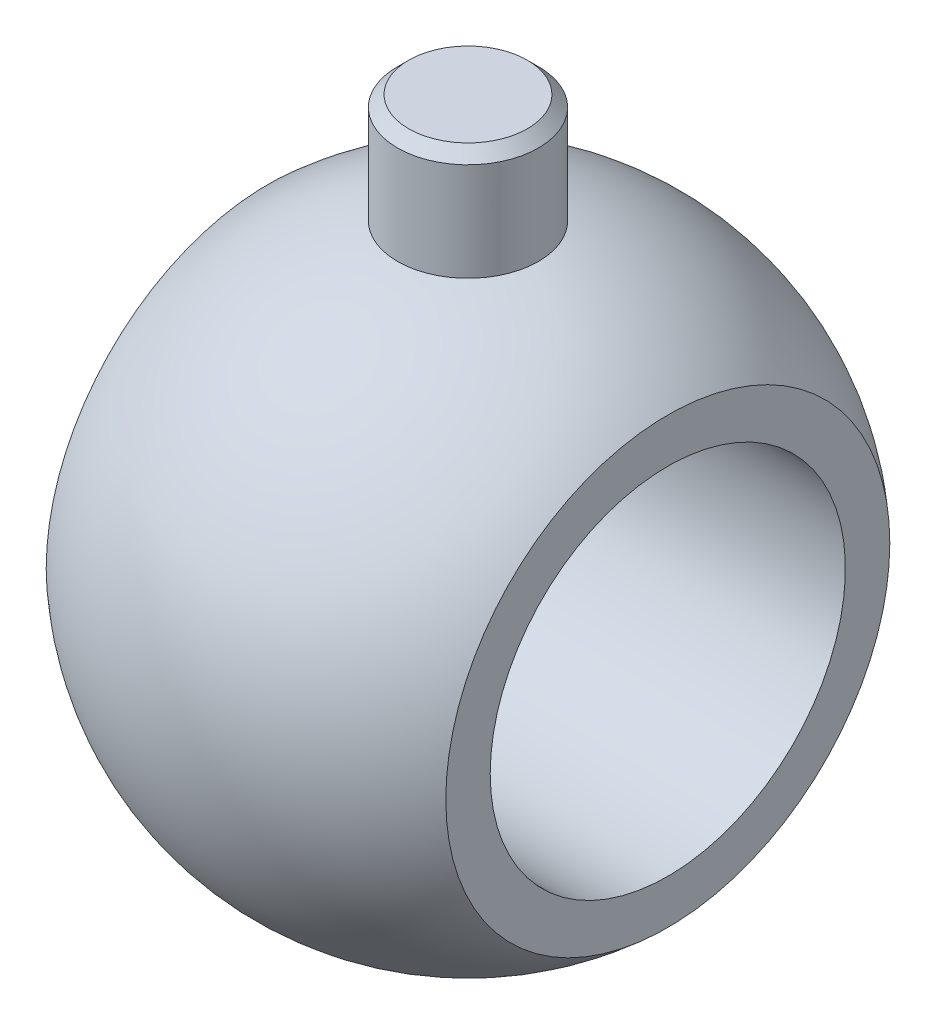
ISO-10303-21;
HEADER;
FILE_DESCRIPTION(('STEP AP214'),'2;1');
FILE_NAME('part.step','',(''),(''),'','','');
FILE_SCHEMA(('AUTOMOTIVE_DESIGN { 1 0 10303 214 1 1 1 1 }'));
ENDSEC;
DATA;
#1=APPLICATION_CONTEXT('core data for automotive mechanical design processes');
#2=APPLICATION_PROTOCOL_DEFINITION('international standard','automotive_design',2000,#1);
#3=PRODUCT_CONTEXT('',#1,'mechanical');
#4=PRODUCT('Part','Part','',(#3));
#5=PRODUCT_RELATED_PRODUCT_CATEGORY('part','',(#4));
#6=PRODUCT_DEFINITION_FORMATION('','',#4);
#7=PRODUCT_DEFINITION_CONTEXT('part definition',#1,'design');
#8=PRODUCT_DEFINITION('design','',#6,#7);
#9=PRODUCT_DEFINITION_SHAPE('','',#8);
#10=(LENGTH_UNIT() NAMED_UNIT(*) SI_UNIT(.MILLI.,.METRE.));
#11=(NAMED_UNIT(*) PLANE_ANGLE_UNIT() SI_UNIT($,.RADIAN.));
#12=(NAMED_UNIT(*) SI_UNIT($,.STERADIAN.) SOLID_ANGLE_UNIT());
#13=UNCERTAINTY_MEASURE_WITH_UNIT(LENGTH_MEASURE(1.E-05),#10,'distance_accuracy_value','');
#14=(GEOMETRIC_REPRESENTATION_CONTEXT(3) GLOBAL_UNCERTAINTY_ASSIGNED_CONTEXT((#13)) GLOBAL_UNIT_ASSIGNED_CONTEXT((#10,
#11,#12)) REPRESENTATION_CONTEXT('',''));
#15=CARTESIAN_POINT('',(0.,0.,0.));
#16=DIRECTION('',(0.,0.,1.));
#17=DIRECTION('',(1.,0.,0.));
#18=AXIS2_PLACEMENT_3D('',#15,#16,#17);
#19=CARTESIAN_POINT('',(0.,0.,0.));
#20=DIRECTION('',(-1.,0.,0.));
#21=DIRECTION('',(0.,0.,1.));
#22=AXIS2_PLACEMENT_3D('',#19,#20,#21);
#23=CYLINDRICAL_SURFACE('',#22,8.);
#24=CARTESIAN_POINT('',(9.,0.,0.));
#25=DIRECTION('',(-1.,0.,0.));
#26=DIRECTION('',(0.,0.,1.));
#27=AXIS2_PLACEMENT_3D('',#24,#25,#26);
#28=CIRCLE('',#27,8.);
#29=CARTESIAN_POINT('',(9.,0.,8.));
#30=VERTEX_POINT('',#29);
#31=EDGE_CURVE('E59',#30,#30,#28,.T.);
#32=ORIENTED_EDGE('',*,*,#31,.F.);
#33=EDGE_LOOP('',(#32));
#34=FACE_BOUND('',#33,.T.);
#35=CARTESIAN_POINT('',(-9.,0.,0.));
#36=DIRECTION('',(-1.,0.,0.));
#37=DIRECTION('',(0.,0.,1.));
#38=AXIS2_PLACEMENT_3D('',#35,#36,#37);
#39=CIRCLE('',#38,8.);
#40=CARTESIAN_POINT('',(-9.,0.,8.));
#41=VERTEX_POINT('',#40);
#42=EDGE_CURVE('E74',#41,#41,#39,.T.);
#43=ORIENTED_EDGE('',*,*,#42,.T.);
#44=EDGE_LOOP('',(#43));
#45=FACE_BOUND('',#44,.T.);
#46=ADVANCED_FACE('F45',(#34,#45),#23,.F.);
#47=CARTESIAN_POINT('',(9.,8.,0.));
#48=DIRECTION('',(-1.,0.,0.));
#49=DIRECTION('',(0.,0.,1.));
#50=AXIS2_PLACEMENT_3D('',#47,#48,#49);
#51=PLANE('',#50);
#52=CARTESIAN_POINT('',(9.,0.,0.));
#53=DIRECTION('',(-1.,0.,0.));
#54=DIRECTION('',(0.,0.,1.));
#55=AXIS2_PLACEMENT_3D('',#52,#53,#54);
#56=CIRCLE('',#55,10.);
#57=CARTESIAN_POINT('',(9.,0.,10.));
#58=VERTEX_POINT('',#57);
#59=EDGE_CURVE('E64',#58,#58,#56,.T.);
#60=ORIENTED_EDGE('',*,*,#59,.F.);
#61=EDGE_LOOP('',(#60));
#62=FACE_BOUND('',#61,.T.);
#63=ORIENTED_EDGE('',*,*,#31,.T.);
#64=EDGE_LOOP('',(#63));
#65=FACE_BOUND('',#64,.T.);
#66=ADVANCED_FACE('F89',(#62,#65),#51,.F.);
#67=CARTESIAN_POINT('',(0.,0.,0.));
#68=DIRECTION('',(-1.,0.,0.));
#69=DIRECTION('',(0.,1.,0.));
#70=AXIS2_PLACEMENT_3D('',#67,#68,#69);
#71=SPHERICAL_SURFACE('',#70,13.4536240470737);
#72=CARTESIAN_POINT('',(0.,13.0736136932372,0.));
#73=DIRECTION('',(0.,-1.,0.));
#74=DIRECTION('',(0.,0.,-1.));
#75=AXIS2_PLACEMENT_3D('',#72,#73,#74);
#76=CIRCLE('',#75,3.175);
#77=CARTESIAN_POINT('',(0.,13.0736136932372,-3.175));
#78=VERTEX_POINT('',#77);
#79=EDGE_CURVE('E78',#78,#78,#76,.F.);
#80=ORIENTED_EDGE('',*,*,#79,.F.);
#81=EDGE_LOOP('',(#80));
#82=FACE_BOUND('',#81,.T.);
#83=CARTESIAN_POINT('',(-9.,0.,0.));
#84=DIRECTION('',(-1.,0.,0.));
#85=DIRECTION('',(0.,0.,1.));
#86=AXIS2_PLACEMENT_3D('',#83,#84,#85);
#87=CIRCLE('',#86,10.);
#88=CARTESIAN_POINT('',(-9.,0.,10.));
#89=VERTEX_POINT('',#88);
#90=EDGE_CURVE('E70',#89,#89,#87,.T.);
#91=ORIENTED_EDGE('',*,*,#90,.F.);
#92=EDGE_LOOP('',(#91));
#93=FACE_BOUND('',#92,.T.);
#94=ORIENTED_EDGE('',*,*,#59,.T.);
#95=EDGE_LOOP('',(#94));
#96=FACE_BOUND('',#95,.T.);
#97=ADVANCED_FACE('F85',(#82,#93,#96),#71,.T.);
#98=CARTESIAN_POINT('',(-9.,10.,0.));
#99=DIRECTION('',(1.,0.,0.));
#100=DIRECTION('',(0.,0.,-1.));
#101=AXIS2_PLACEMENT_3D('',#98,#99,#100);
#102=PLANE('',#101);
#103=ORIENTED_EDGE('',*,*,#42,.F.);
#104=EDGE_LOOP('',(#103));
#105=FACE_BOUND('',#104,.T.);
#106=ORIENTED_EDGE('',*,*,#90,.T.);
#107=EDGE_LOOP('',(#106));
#108=FACE_BOUND('',#107,.T.);
#109=ADVANCED_FACE('F88',(#105,#108),#102,.F.);
#110=CARTESIAN_POINT('',(0.,-13.4546240470737,0.));
#111=DIRECTION('',(0.,1.,0.));
#112=DIRECTION('',(0.,0.,1.));
#113=AXIS2_PLACEMENT_3D('',#110,#111,#112);
#114=CYLINDRICAL_SURFACE('',#113,3.175);
#115=CARTESIAN_POINT('',(0.,17.5,0.));
#116=DIRECTION('',(0.,1.,0.));
#117=DIRECTION('',(0.,0.,1.));
#118=AXIS2_PLACEMENT_3D('',#115,#116,#117);
#119=CIRCLE('',#118,3.175);
#120=CARTESIAN_POINT('',(0.,17.5,3.175));
#121=VERTEX_POINT('',#120);
#122=EDGE_CURVE('E10',#121,#121,#119,.F.);
#123=ORIENTED_EDGE('',*,*,#122,.T.);
#124=EDGE_LOOP('',(#123));
#125=FACE_BOUND('',#124,.T.);
#126=ORIENTED_EDGE('',*,*,#79,.T.);
#127=EDGE_LOOP('',(#126));
#128=FACE_BOUND('',#127,.T.);
#129=ADVANCED_FACE('F83',(#125,#128),#114,.T.);
#130=CARTESIAN_POINT('',(0.,18.,0.));
#131=DIRECTION('',(0.,1.,0.));
#132=DIRECTION('',(0.,0.,1.));
#133=AXIS2_PLACEMENT_3D('',#130,#131,#132);
#134=PLANE('',#133);
#135=CARTESIAN_POINT('',(0.,18.,0.));
#136=DIRECTION('',(0.,1.,0.));
#137=DIRECTION('',(0.,0.,1.));
#138=AXIS2_PLACEMENT_3D('',#135,#136,#137);
#139=CIRCLE('',#138,2.675);
#140=CARTESIAN_POINT('',(0.,18.,2.675));
#141=VERTEX_POINT('',#140);
#142=EDGE_CURVE('E54',#141,#141,#139,.T.);
#143=ORIENTED_EDGE('',*,*,#142,.T.);
#144=EDGE_LOOP('',(#143));
#145=FACE_BOUND('',#144,.T.);
#146=ADVANCED_FACE('F111',(#145),#134,.T.);
#147=CARTESIAN_POINT('',(0.,18.,0.));
#148=DIRECTION('',(0.,-1.,0.));
#149=DIRECTION('',(0.,0.,-1.));
#150=AXIS2_PLACEMENT_3D('',#147,#148,#149);
#151=CONICAL_SURFACE('',#150,2.675,0.785398163397451);
#152=ORIENTED_EDGE('',*,*,#122,.F.);
#153=EDGE_LOOP('',(#152));
#154=FACE_BOUND('',#153,.T.);
#155=ORIENTED_EDGE('',*,*,#142,.F.);
#156=EDGE_LOOP('',(#155));
#157=FACE_BOUND('',#156,.T.);
#158=ADVANCED_FACE('F48',(#154,#157),#151,.T.);
#159=CLOSED_SHELL('',(#46,#66,#97,#109,#129,#146,#158));
#160=MANIFOLD_SOLID_BREP('B2',#159);
#161=ADVANCED_BREP_SHAPE_REPRESENTATION('',(#18,#160),#14);
#162=SHAPE_DEFINITION_REPRESENTATION(#9,#161);
ENDSEC;
END-ISO-10303-21;
